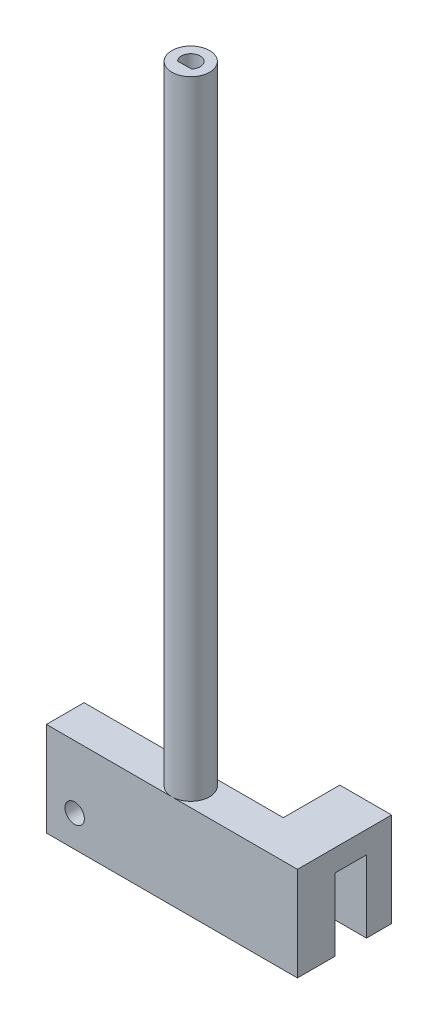
ISO-10303-21;
HEADER;
FILE_DESCRIPTION(('STEP AP214'),'2;1');
FILE_NAME('part.step','',(''),(''),'','','');
FILE_SCHEMA(('AUTOMOTIVE_DESIGN { 1 0 10303 214 1 1 1 1 }'));
ENDSEC;
DATA;
#1=APPLICATION_CONTEXT('core data for automotive mechanical design processes');
#2=APPLICATION_PROTOCOL_DEFINITION('international standard','automotive_design',2000,#1);
#3=PRODUCT_CONTEXT('',#1,'mechanical');
#4=PRODUCT('Part','Part','',(#3));
#5=PRODUCT_RELATED_PRODUCT_CATEGORY('part','',(#4));
#6=PRODUCT_DEFINITION_FORMATION('','',#4);
#7=PRODUCT_DEFINITION_CONTEXT('part definition',#1,'design');
#8=PRODUCT_DEFINITION('design','',#6,#7);
#9=PRODUCT_DEFINITION_SHAPE('','',#8);
#10=(LENGTH_UNIT() NAMED_UNIT(*) SI_UNIT(.MILLI.,.METRE.));
#11=(NAMED_UNIT(*) PLANE_ANGLE_UNIT() SI_UNIT($,.RADIAN.));
#12=(NAMED_UNIT(*) SI_UNIT($,.STERADIAN.) SOLID_ANGLE_UNIT());
#13=UNCERTAINTY_MEASURE_WITH_UNIT(LENGTH_MEASURE(1.E-05),#10,'distance_accuracy_value','');
#14=(GEOMETRIC_REPRESENTATION_CONTEXT(3) GLOBAL_UNCERTAINTY_ASSIGNED_CONTEXT((#13)) GLOBAL_UNIT_ASSIGNED_CONTEXT((#10,
#11,#12)) REPRESENTATION_CONTEXT('',''));
#15=CARTESIAN_POINT('',(0.,0.,0.));
#16=DIRECTION('',(0.,0.,1.));
#17=DIRECTION('',(1.,0.,0.));
#18=AXIS2_PLACEMENT_3D('',#15,#16,#17);
#19=CARTESIAN_POINT('',(0.,-15.,0.));
#20=DIRECTION('',(0.,1.,0.));
#21=DIRECTION('',(0.,0.,1.));
#22=AXIS2_PLACEMENT_3D('',#19,#20,#21);
#23=PLANE('',#22);
#24=DIRECTION('',(1.,0.,0.));
#25=VECTOR('',#24,1.);
#26=CARTESIAN_POINT('',(-20.,-15.,-3.));
#27=LINE('',#26,#25);
#28=CARTESIAN_POINT('',(-20.,-15.,-3.));
#29=VERTEX_POINT('',#28);
#30=CARTESIAN_POINT('',(20.,-15.,-3.));
#31=VERTEX_POINT('',#30);
#32=EDGE_CURVE('E204',#29,#31,#27,.T.);
#33=ORIENTED_EDGE('',*,*,#32,.T.);
#34=DIRECTION('',(0.,0.,1.));
#35=VECTOR('',#34,1.);
#36=CARTESIAN_POINT('',(20.,-15.,-3.));
#37=LINE('',#36,#35);
#38=CARTESIAN_POINT('',(20.,-15.,3.));
#39=VERTEX_POINT('',#38);
#40=EDGE_CURVE('E198',#31,#39,#37,.T.);
#41=ORIENTED_EDGE('',*,*,#40,.T.);
#42=DIRECTION('',(-1.,0.,0.));
#43=VECTOR('',#42,1.);
#44=CARTESIAN_POINT('',(-20.,-15.,3.));
#45=LINE('',#44,#43);
#46=CARTESIAN_POINT('',(-20.,-15.,3.));
#47=VERTEX_POINT('',#46);
#48=EDGE_CURVE('E197',#39,#47,#45,.T.);
#49=ORIENTED_EDGE('',*,*,#48,.T.);
#50=DIRECTION('',(0.,0.,-1.));
#51=VECTOR('',#50,1.);
#52=CARTESIAN_POINT('',(-20.,-15.,-3.));
#53=LINE('',#52,#51);
#54=EDGE_CURVE('E201',#47,#29,#53,.T.);
#55=ORIENTED_EDGE('',*,*,#54,.T.);
#56=EDGE_LOOP('',(#33,#41,#49,#55));
#57=FACE_BOUND('',#56,.T.);
#58=ADVANCED_FACE('F39',(#57),#23,.F.);
#59=CARTESIAN_POINT('',(-20.,-15.,-3.));
#60=DIRECTION('',(0.,0.,1.));
#61=DIRECTION('',(1.,0.,0.));
#62=AXIS2_PLACEMENT_3D('',#59,#60,#61);
#63=PLANE('',#62);
#64=CARTESIAN_POINT('',(-15.5,-10.,-3.));
#65=DIRECTION('',(0.,0.,-1.));
#66=DIRECTION('',(-1.,0.,0.));
#67=AXIS2_PLACEMENT_3D('',#64,#65,#66);
#68=CIRCLE('',#67,1.55);
#69=CARTESIAN_POINT('',(-17.05,-10.,-3.));
#70=VERTEX_POINT('',#69);
#71=EDGE_CURVE('E184',#70,#70,#68,.T.);
#72=ORIENTED_EDGE('',*,*,#71,.F.);
#73=EDGE_LOOP('',(#72));
#74=FACE_BOUND('',#73,.T.);
#75=DIRECTION('',(0.,1.,0.));
#76=VECTOR('',#75,1.);
#77=CARTESIAN_POINT('',(11.75,-15.,-3.));
#78=LINE('',#77,#76);
#79=CARTESIAN_POINT('',(11.75,-3.5,-3.));
#80=VERTEX_POINT('',#79);
#81=CARTESIAN_POINT('',(11.75,0.,-3.));
#82=VERTEX_POINT('',#81);
#83=EDGE_CURVE('E166',#80,#82,#78,.T.);
#84=ORIENTED_EDGE('',*,*,#83,.F.);
#85=DIRECTION('',(-1.,0.,0.));
#86=VECTOR('',#85,1.);
#87=CARTESIAN_POINT('',(11.75,-3.5,-3.));
#88=LINE('',#87,#86);
#89=CARTESIAN_POINT('',(20.,-3.5,-3.));
#90=VERTEX_POINT('',#89);
#91=EDGE_CURVE('E55',#90,#80,#88,.T.);
#92=ORIENTED_EDGE('',*,*,#91,.F.);
#93=DIRECTION('',(0.,-1.,0.));
#94=VECTOR('',#93,1.);
#95=CARTESIAN_POINT('',(20.,-3.5,-3.));
#96=LINE('',#95,#94);
#97=EDGE_CURVE('E156',#90,#31,#96,.T.);
#98=ORIENTED_EDGE('',*,*,#97,.T.);
#99=ORIENTED_EDGE('',*,*,#32,.F.);
#100=DIRECTION('',(0.,1.,0.));
#101=VECTOR('',#100,1.);
#102=CARTESIAN_POINT('',(-20.,-15.,-3.));
#103=LINE('',#102,#101);
#104=CARTESIAN_POINT('',(-20.,0.,-3.));
#105=VERTEX_POINT('',#104);
#106=EDGE_CURVE('E207',#29,#105,#103,.T.);
#107=ORIENTED_EDGE('',*,*,#106,.T.);
#108=DIRECTION('',(1.,0.,0.));
#109=VECTOR('',#108,1.);
#110=CARTESIAN_POINT('',(-20.,0.,-3.));
#111=LINE('',#110,#109);
#112=CARTESIAN_POINT('',(0.,0.,-3.));
#113=VERTEX_POINT('',#112);
#114=EDGE_CURVE('E218',#105,#113,#111,.T.);
#115=ORIENTED_EDGE('',*,*,#114,.T.);
#116=EDGE_CURVE('E217',#113,#82,#111,.T.);
#117=ORIENTED_EDGE('',*,*,#116,.T.);
#118=EDGE_LOOP('',(#84,#92,#98,#99,#107,#115,#117));
#119=FACE_BOUND('',#118,.T.);
#120=ADVANCED_FACE('F280',(#74,#119),#63,.F.);
#121=CARTESIAN_POINT('',(0.,100.,0.));
#122=DIRECTION('',(0.,-1.,0.));
#123=DIRECTION('',(0.,0.,-1.));
#124=AXIS2_PLACEMENT_3D('',#121,#122,#123);
#125=CYLINDRICAL_SURFACE('',#124,3.);
#126=CARTESIAN_POINT('',(0.,100.,0.));
#127=DIRECTION('',(0.,1.,0.));
#128=DIRECTION('',(0.,0.,1.));
#129=AXIS2_PLACEMENT_3D('',#126,#127,#128);
#130=CIRCLE('',#129,3.);
#131=CARTESIAN_POINT('',(0.,100.,3.));
#132=VERTEX_POINT('',#131);
#133=EDGE_CURVE('E11',#132,#132,#130,.T.);
#134=ORIENTED_EDGE('',*,*,#133,.F.);
#135=EDGE_LOOP('',(#134));
#136=FACE_BOUND('',#135,.T.);
#137=CARTESIAN_POINT('',(0.,0.,0.));
#138=DIRECTION('',(0.,1.,0.));
#139=DIRECTION('',(0.,0.,1.));
#140=AXIS2_PLACEMENT_3D('',#137,#138,#139);
#141=CIRCLE('',#140,3.);
#142=CARTESIAN_POINT('',(0.,0.,3.));
#143=VERTEX_POINT('',#142);
#144=EDGE_CURVE('E43',#143,#113,#141,.T.);
#145=ORIENTED_EDGE('',*,*,#144,.T.);
#146=EDGE_CURVE('E251',#113,#143,#141,.T.);
#147=ORIENTED_EDGE('',*,*,#146,.T.);
#148=EDGE_LOOP('',(#145,#147));
#149=FACE_BOUND('',#148,.T.);
#150=ADVANCED_FACE('F41',(#136,#149),#125,.T.);
#151=CARTESIAN_POINT('',(0.,100.,0.));
#152=DIRECTION('',(0.,1.,0.));
#153=DIRECTION('',(0.,0.,1.));
#154=AXIS2_PLACEMENT_3D('',#151,#152,#153);
#155=PLANE('',#154);
#156=CARTESIAN_POINT('',(0.,100.,0.));
#157=DIRECTION('',(0.,1.,0.));
#158=DIRECTION('',(0.,0.,1.));
#159=AXIS2_PLACEMENT_3D('',#156,#157,#158);
#160=CIRCLE('',#159,1.5);
#161=CARTESIAN_POINT('',(1.13442926526063,100.,0.981361422779718));
#162=VERTEX_POINT('',#161);
#163=CARTESIAN_POINT('',(-1.10133251917623,100.,1.0183647098191));
#164=VERTEX_POINT('',#163);
#165=EDGE_CURVE('E232',#162,#164,#160,.T.);
#166=ORIENTED_EDGE('',*,*,#165,.F.);
#167=DIRECTION('',(0.999863066299409,0.,-0.0165483730421988));
#168=VECTOR('',#167,1.);
#169=CARTESIAN_POINT('',(-1.10133251917623,100.,1.0183647098191));
#170=LINE('',#169,#168);
#171=EDGE_CURVE('E238',#164,#162,#170,.T.);
#172=ORIENTED_EDGE('',*,*,#171,.F.);
#173=EDGE_LOOP('',(#166,#172));
#174=FACE_BOUND('',#173,.T.);
#175=ORIENTED_EDGE('',*,*,#133,.T.);
#176=EDGE_LOOP('',(#175));
#177=FACE_BOUND('',#176,.T.);
#178=ADVANCED_FACE('F262',(#174,#177),#155,.T.);
#179=CARTESIAN_POINT('',(0.,94.,0.));
#180=DIRECTION('',(0.,1.,0.));
#181=DIRECTION('',(0.,0.,1.));
#182=AXIS2_PLACEMENT_3D('',#179,#180,#181);
#183=CYLINDRICAL_SURFACE('',#182,1.5);
#184=ORIENTED_EDGE('',*,*,#165,.T.);
#185=DIRECTION('',(0.,1.,0.));
#186=VECTOR('',#185,1.);
#187=CARTESIAN_POINT('',(-1.10133251917623,94.,1.0183647098191));
#188=LINE('',#187,#186);
#189=CARTESIAN_POINT('',(-1.10133251917623,94.,1.0183647098191));
#190=VERTEX_POINT('',#189);
#191=EDGE_CURVE('E242',#190,#164,#188,.T.);
#192=ORIENTED_EDGE('',*,*,#191,.F.);
#193=CARTESIAN_POINT('',(0.,94.,0.));
#194=DIRECTION('',(0.,1.,0.));
#195=DIRECTION('',(0.,0.,1.));
#196=AXIS2_PLACEMENT_3D('',#193,#194,#195);
#197=CIRCLE('',#196,1.5);
#198=CARTESIAN_POINT('',(1.13442926526063,94.,0.981361422779718));
#199=VERTEX_POINT('',#198);
#200=EDGE_CURVE('E233',#199,#190,#197,.T.);
#201=ORIENTED_EDGE('',*,*,#200,.F.);
#202=DIRECTION('',(0.,1.,0.));
#203=VECTOR('',#202,1.);
#204=CARTESIAN_POINT('',(1.13442926526063,94.,0.981361422779718));
#205=LINE('',#204,#203);
#206=EDGE_CURVE('E248',#199,#162,#205,.T.);
#207=ORIENTED_EDGE('',*,*,#206,.T.);
#208=EDGE_LOOP('',(#184,#192,#201,#207));
#209=FACE_BOUND('',#208,.T.);
#210=ADVANCED_FACE('F264',(#209),#183,.F.);
#211=CARTESIAN_POINT('',(-1.10133251917623,94.,1.0183647098191));
#212=DIRECTION('',(0.0165483730421988,0.,0.999863066299409));
#213=DIRECTION('',(0.999863066299409,0.,-0.0165483730421988));
#214=AXIS2_PLACEMENT_3D('',#211,#212,#213);
#215=PLANE('',#214);
#216=ORIENTED_EDGE('',*,*,#171,.T.);
#217=ORIENTED_EDGE('',*,*,#206,.F.);
#218=DIRECTION('',(0.999863066299409,0.,-0.0165483730421988));
#219=VECTOR('',#218,1.);
#220=CARTESIAN_POINT('',(-1.10133251917623,94.,1.0183647098191));
#221=LINE('',#220,#219);
#222=EDGE_CURVE('E237',#190,#199,#221,.T.);
#223=ORIENTED_EDGE('',*,*,#222,.F.);
#224=ORIENTED_EDGE('',*,*,#191,.T.);
#225=EDGE_LOOP('',(#216,#217,#223,#224));
#226=FACE_BOUND('',#225,.T.);
#227=ADVANCED_FACE('F257',(#226),#215,.F.);
#228=CARTESIAN_POINT('',(0.,94.,0.));
#229=DIRECTION('',(0.,1.,0.));
#230=DIRECTION('',(0.,0.,1.));
#231=AXIS2_PLACEMENT_3D('',#228,#229,#230);
#232=PLANE('',#231);
#233=ORIENTED_EDGE('',*,*,#200,.T.);
#234=ORIENTED_EDGE('',*,*,#222,.T.);
#235=EDGE_LOOP('',(#233,#234));
#236=FACE_BOUND('',#235,.T.);
#237=ADVANCED_FACE('F266',(#236),#232,.T.);
#238=CARTESIAN_POINT('',(0.,0.,0.));
#239=DIRECTION('',(0.,1.,0.));
#240=DIRECTION('',(0.,0.,1.));
#241=AXIS2_PLACEMENT_3D('',#238,#239,#240);
#242=PLANE('',#241);
#243=ORIENTED_EDGE('',*,*,#144,.F.);
#244=DIRECTION('',(-1.,0.,0.));
#245=VECTOR('',#244,1.);
#246=CARTESIAN_POINT('',(-20.,0.,3.));
#247=LINE('',#246,#245);
#248=CARTESIAN_POINT('',(20.,0.,3.));
#249=VERTEX_POINT('',#248);
#250=EDGE_CURVE('E63',#249,#143,#247,.T.);
#251=ORIENTED_EDGE('',*,*,#250,.F.);
#252=DIRECTION('',(0.,0.,1.));
#253=VECTOR('',#252,1.);
#254=CARTESIAN_POINT('',(20.,0.,-3.));
#255=LINE('',#254,#253);
#256=CARTESIAN_POINT('',(20.,0.,-12.));
#257=VERTEX_POINT('',#256);
#258=EDGE_CURVE('E189',#257,#249,#255,.T.);
#259=ORIENTED_EDGE('',*,*,#258,.F.);
#260=DIRECTION('',(1.,0.,0.));
#261=VECTOR('',#260,1.);
#262=CARTESIAN_POINT('',(20.,0.,-12.));
#263=LINE('',#262,#261);
#264=CARTESIAN_POINT('',(11.75,0.,-12.));
#265=VERTEX_POINT('',#264);
#266=EDGE_CURVE('E172',#265,#257,#263,.T.);
#267=ORIENTED_EDGE('',*,*,#266,.F.);
#268=DIRECTION('',(0.,0.,1.));
#269=VECTOR('',#268,1.);
#270=CARTESIAN_POINT('',(11.75,0.,-12.));
#271=LINE('',#270,#269);
#272=EDGE_CURVE('E176',#265,#82,#271,.T.);
#273=ORIENTED_EDGE('',*,*,#272,.T.);
#274=ORIENTED_EDGE('',*,*,#116,.F.);
#275=EDGE_LOOP('',(#243,#251,#259,#267,#273,#274));
#276=FACE_BOUND('',#275,.T.);
#277=ADVANCED_FACE('F268',(#276),#242,.T.);
#278=ORIENTED_EDGE('',*,*,#146,.F.);
#279=ORIENTED_EDGE('',*,*,#114,.F.);
#280=DIRECTION('',(0.,0.,-1.));
#281=VECTOR('',#280,1.);
#282=CARTESIAN_POINT('',(-20.,0.,-3.));
#283=LINE('',#282,#281);
#284=CARTESIAN_POINT('',(-20.,0.,3.));
#285=VERTEX_POINT('',#284);
#286=EDGE_CURVE('E214',#285,#105,#283,.T.);
#287=ORIENTED_EDGE('',*,*,#286,.F.);
#288=EDGE_CURVE('E211',#143,#285,#247,.T.);
#289=ORIENTED_EDGE('',*,*,#288,.F.);
#290=EDGE_LOOP('',(#278,#279,#287,#289));
#291=FACE_BOUND('',#290,.T.);
#292=ADVANCED_FACE('F274',(#291),#242,.T.);
#293=CARTESIAN_POINT('',(20.,-15.,-3.));
#294=DIRECTION('',(-1.,0.,0.));
#295=DIRECTION('',(0.,0.,1.));
#296=AXIS2_PLACEMENT_3D('',#293,#294,#295);
#297=PLANE('',#296);
#298=ORIENTED_EDGE('',*,*,#40,.F.);
#299=ORIENTED_EDGE('',*,*,#97,.F.);
#300=DIRECTION('',(0.,0.,1.));
#301=VECTOR('',#300,1.);
#302=CARTESIAN_POINT('',(20.,-3.5,-3.));
#303=LINE('',#302,#301);
#304=CARTESIAN_POINT('',(20.,-3.5,-8.));
#305=VERTEX_POINT('',#304);
#306=EDGE_CURVE('E138',#305,#90,#303,.T.);
#307=ORIENTED_EDGE('',*,*,#306,.F.);
#308=DIRECTION('',(0.,-1.,0.));
#309=VECTOR('',#308,1.);
#310=CARTESIAN_POINT('',(20.,-3.5,-8.));
#311=LINE('',#310,#309);
#312=CARTESIAN_POINT('',(20.,-15.,-8.));
#313=VERTEX_POINT('',#312);
#314=EDGE_CURVE('E135',#305,#313,#311,.T.);
#315=ORIENTED_EDGE('',*,*,#314,.T.);
#316=CARTESIAN_POINT('',(20.,-15.,-12.));
#317=VERTEX_POINT('',#316);
#318=EDGE_CURVE('E193',#317,#313,#37,.T.);
#319=ORIENTED_EDGE('',*,*,#318,.F.);
#320=DIRECTION('',(0.,-1.,0.));
#321=VECTOR('',#320,1.);
#322=CARTESIAN_POINT('',(20.,-15.,-12.));
#323=LINE('',#322,#321);
#324=EDGE_CURVE('E161',#257,#317,#323,.T.);
#325=ORIENTED_EDGE('',*,*,#324,.F.);
#326=ORIENTED_EDGE('',*,*,#258,.T.);
#327=DIRECTION('',(0.,1.,0.));
#328=VECTOR('',#327,1.);
#329=CARTESIAN_POINT('',(20.,-15.,3.));
#330=LINE('',#329,#328);
#331=EDGE_CURVE('E229',#39,#249,#330,.T.);
#332=ORIENTED_EDGE('',*,*,#331,.F.);
#333=EDGE_LOOP('',(#298,#299,#307,#315,#319,#325,#326,#332));
#334=FACE_BOUND('',#333,.T.);
#335=ADVANCED_FACE('F306',(#334),#297,.F.);
#336=CARTESIAN_POINT('',(-20.,-15.,3.));
#337=DIRECTION('',(0.,0.,-1.));
#338=DIRECTION('',(-1.,0.,0.));
#339=AXIS2_PLACEMENT_3D('',#336,#337,#338);
#340=PLANE('',#339);
#341=CARTESIAN_POINT('',(-15.5,-10.,3.));
#342=DIRECTION('',(0.,0.,-1.));
#343=DIRECTION('',(-1.,0.,0.));
#344=AXIS2_PLACEMENT_3D('',#341,#342,#343);
#345=CIRCLE('',#344,1.55);
#346=CARTESIAN_POINT('',(-17.05,-10.,3.));
#347=VERTEX_POINT('',#346);
#348=EDGE_CURVE('E185',#347,#347,#345,.T.);
#349=ORIENTED_EDGE('',*,*,#348,.T.);
#350=EDGE_LOOP('',(#349));
#351=FACE_BOUND('',#350,.T.);
#352=ORIENTED_EDGE('',*,*,#250,.T.);
#353=ORIENTED_EDGE('',*,*,#288,.T.);
#354=DIRECTION('',(0.,1.,0.));
#355=VECTOR('',#354,1.);
#356=CARTESIAN_POINT('',(-20.,-15.,3.));
#357=LINE('',#356,#355);
#358=EDGE_CURVE('E225',#47,#285,#357,.T.);
#359=ORIENTED_EDGE('',*,*,#358,.F.);
#360=ORIENTED_EDGE('',*,*,#48,.F.);
#361=ORIENTED_EDGE('',*,*,#331,.T.);
#362=EDGE_LOOP('',(#352,#353,#359,#360,#361));
#363=FACE_BOUND('',#362,.T.);
#364=ADVANCED_FACE('F299',(#351,#363),#340,.F.);
#365=CARTESIAN_POINT('',(-20.,-15.,-3.));
#366=DIRECTION('',(1.,0.,0.));
#367=DIRECTION('',(0.,0.,-1.));
#368=AXIS2_PLACEMENT_3D('',#365,#366,#367);
#369=PLANE('',#368);
#370=ORIENTED_EDGE('',*,*,#286,.T.);
#371=ORIENTED_EDGE('',*,*,#106,.F.);
#372=ORIENTED_EDGE('',*,*,#54,.F.);
#373=ORIENTED_EDGE('',*,*,#358,.T.);
#374=EDGE_LOOP('',(#370,#371,#372,#373));
#375=FACE_BOUND('',#374,.T.);
#376=ADVANCED_FACE('F292',(#375),#369,.F.);
#377=ORIENTED_EDGE('',*,*,#318,.T.);
#378=DIRECTION('',(1.,0.,0.));
#379=VECTOR('',#378,1.);
#380=CARTESIAN_POINT('',(11.75,-15.,-8.));
#381=LINE('',#380,#379);
#382=CARTESIAN_POINT('',(11.75,-15.,-8.));
#383=VERTEX_POINT('',#382);
#384=EDGE_CURVE('E145',#383,#313,#381,.T.);
#385=ORIENTED_EDGE('',*,*,#384,.F.);
#386=DIRECTION('',(0.,0.,1.));
#387=VECTOR('',#386,1.);
#388=CARTESIAN_POINT('',(11.75,-15.,-12.));
#389=LINE('',#388,#387);
#390=CARTESIAN_POINT('',(11.75,-15.,-12.));
#391=VERTEX_POINT('',#390);
#392=EDGE_CURVE('E151',#391,#383,#389,.T.);
#393=ORIENTED_EDGE('',*,*,#392,.F.);
#394=DIRECTION('',(-1.,0.,0.));
#395=VECTOR('',#394,1.);
#396=CARTESIAN_POINT('',(20.,-15.,-12.));
#397=LINE('',#396,#395);
#398=EDGE_CURVE('E165',#317,#391,#397,.T.);
#399=ORIENTED_EDGE('',*,*,#398,.F.);
#400=EDGE_LOOP('',(#377,#385,#393,#399));
#401=FACE_BOUND('',#400,.T.);
#402=ADVANCED_FACE('F283',(#401),#23,.F.);
#403=CARTESIAN_POINT('',(-15.5,-10.,3.));
#404=DIRECTION('',(0.,0.,-1.));
#405=DIRECTION('',(-1.,0.,0.));
#406=AXIS2_PLACEMENT_3D('',#403,#404,#405);
#407=CYLINDRICAL_SURFACE('',#406,1.55);
#408=ORIENTED_EDGE('',*,*,#348,.F.);
#409=EDGE_LOOP('',(#408));
#410=FACE_BOUND('',#409,.T.);
#411=ORIENTED_EDGE('',*,*,#71,.T.);
#412=EDGE_LOOP('',(#411));
#413=FACE_BOUND('',#412,.T.);
#414=ADVANCED_FACE('F291',(#410,#413),#407,.F.);
#415=CARTESIAN_POINT('',(11.75,-15.,-12.));
#416=DIRECTION('',(1.,0.,0.));
#417=DIRECTION('',(0.,0.,-1.));
#418=AXIS2_PLACEMENT_3D('',#415,#416,#417);
#419=PLANE('',#418);
#420=ORIENTED_EDGE('',*,*,#392,.T.);
#421=DIRECTION('',(0.,-1.,0.));
#422=VECTOR('',#421,1.);
#423=CARTESIAN_POINT('',(11.75,-3.5,-8.));
#424=LINE('',#423,#422);
#425=CARTESIAN_POINT('',(11.75,-3.5,-8.));
#426=VERTEX_POINT('',#425);
#427=EDGE_CURVE('E132',#426,#383,#424,.T.);
#428=ORIENTED_EDGE('',*,*,#427,.F.);
#429=DIRECTION('',(0.,0.,-1.));
#430=VECTOR('',#429,1.);
#431=CARTESIAN_POINT('',(11.75,-3.5,-3.));
#432=LINE('',#431,#430);
#433=EDGE_CURVE('E139',#80,#426,#432,.T.);
#434=ORIENTED_EDGE('',*,*,#433,.F.);
#435=ORIENTED_EDGE('',*,*,#83,.T.);
#436=ORIENTED_EDGE('',*,*,#272,.F.);
#437=DIRECTION('',(0.,1.,0.));
#438=VECTOR('',#437,1.);
#439=CARTESIAN_POINT('',(11.75,-15.,-12.));
#440=LINE('',#439,#438);
#441=EDGE_CURVE('E169',#391,#265,#440,.T.);
#442=ORIENTED_EDGE('',*,*,#441,.F.);
#443=EDGE_LOOP('',(#420,#428,#434,#435,#436,#442));
#444=FACE_BOUND('',#443,.T.);
#445=ADVANCED_FACE('F148',(#444),#419,.F.);
#446=CARTESIAN_POINT('',(0.,0.,-12.));
#447=DIRECTION('',(0.,0.,1.));
#448=DIRECTION('',(1.,0.,0.));
#449=AXIS2_PLACEMENT_3D('',#446,#447,#448);
#450=PLANE('',#449);
#451=ORIENTED_EDGE('',*,*,#324,.T.);
#452=ORIENTED_EDGE('',*,*,#398,.T.);
#453=ORIENTED_EDGE('',*,*,#441,.T.);
#454=ORIENTED_EDGE('',*,*,#266,.T.);
#455=EDGE_LOOP('',(#451,#452,#453,#454));
#456=FACE_BOUND('',#455,.T.);
#457=ADVANCED_FACE('F338',(#456),#450,.F.);
#458=CARTESIAN_POINT('',(11.75,-3.5,-8.));
#459=DIRECTION('',(0.,0.,-1.));
#460=DIRECTION('',(-1.,0.,0.));
#461=AXIS2_PLACEMENT_3D('',#458,#459,#460);
#462=PLANE('',#461);
#463=ORIENTED_EDGE('',*,*,#384,.T.);
#464=ORIENTED_EDGE('',*,*,#314,.F.);
#465=DIRECTION('',(1.,0.,0.));
#466=VECTOR('',#465,1.);
#467=CARTESIAN_POINT('',(11.75,-3.5,-8.));
#468=LINE('',#467,#466);
#469=EDGE_CURVE('E129',#426,#305,#468,.T.);
#470=ORIENTED_EDGE('',*,*,#469,.F.);
#471=ORIENTED_EDGE('',*,*,#427,.T.);
#472=EDGE_LOOP('',(#463,#464,#470,#471));
#473=FACE_BOUND('',#472,.T.);
#474=ADVANCED_FACE('F130',(#473),#462,.F.);
#475=CARTESIAN_POINT('',(0.,-3.5,0.));
#476=DIRECTION('',(0.,-1.,0.));
#477=DIRECTION('',(0.,0.,-1.));
#478=AXIS2_PLACEMENT_3D('',#475,#476,#477);
#479=PLANE('',#478);
#480=ORIENTED_EDGE('',*,*,#433,.T.);
#481=ORIENTED_EDGE('',*,*,#469,.T.);
#482=ORIENTED_EDGE('',*,*,#306,.T.);
#483=ORIENTED_EDGE('',*,*,#91,.T.);
#484=EDGE_LOOP('',(#480,#481,#482,#483));
#485=FACE_BOUND('',#484,.T.);
#486=ADVANCED_FACE('F141',(#485),#479,.T.);
#487=CLOSED_SHELL('',(#58,#120,#150,#178,#210,#227,#237,#277,#292,#335,#364,#376,#402,#414,#445,
#457,#474,#486));
#488=MANIFOLD_SOLID_BREP('B2',#487);
#489=ADVANCED_BREP_SHAPE_REPRESENTATION('',(#18,#488),#14);
#490=SHAPE_DEFINITION_REPRESENTATION(#9,#489);
ENDSEC;
END-ISO-10303-21;
